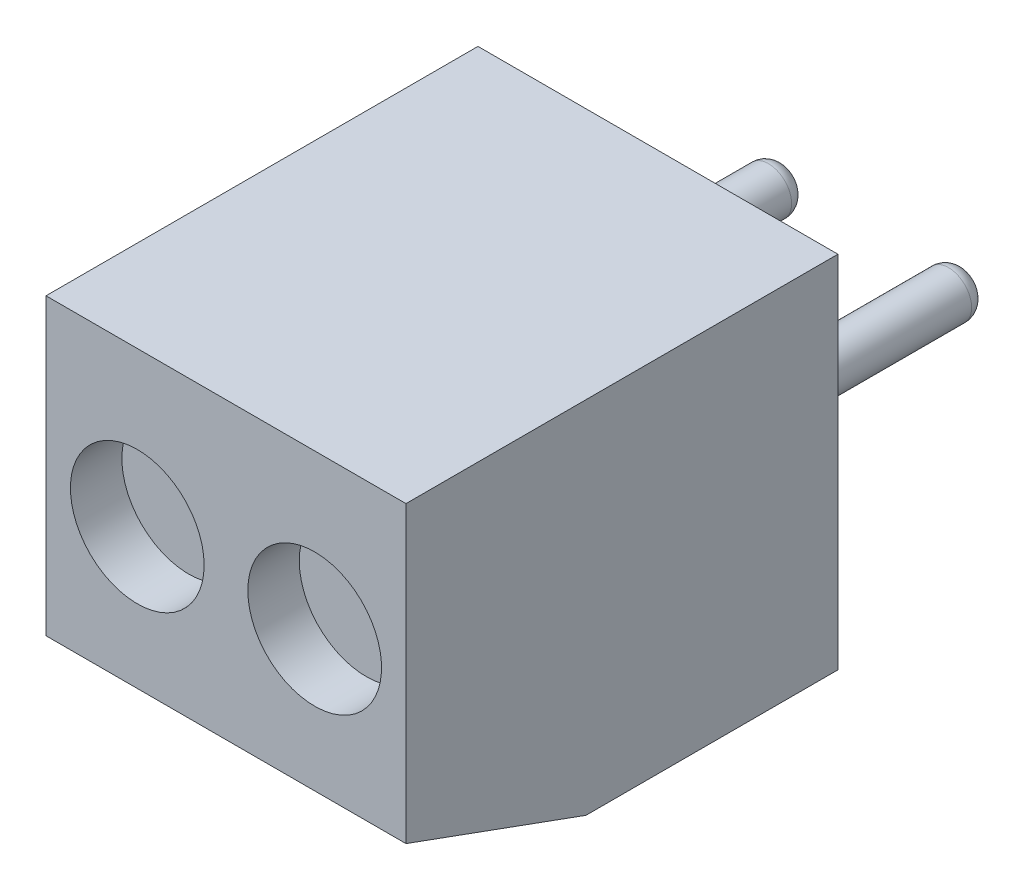
ISO-10303-21;
HEADER;
FILE_DESCRIPTION(('STEP AP214'),'2;1');
FILE_NAME('part.step','',(''),(''),'','','');
FILE_SCHEMA(('AUTOMOTIVE_DESIGN { 1 0 10303 214 1 1 1 1 }'));
ENDSEC;
DATA;
#1=APPLICATION_CONTEXT('core data for automotive mechanical design processes');
#2=APPLICATION_PROTOCOL_DEFINITION('international standard','automotive_design',2000,#1);
#3=PRODUCT_CONTEXT('',#1,'mechanical');
#4=PRODUCT('Part','Part','',(#3));
#5=PRODUCT_RELATED_PRODUCT_CATEGORY('part','',(#4));
#6=PRODUCT_DEFINITION_FORMATION('','',#4);
#7=PRODUCT_DEFINITION_CONTEXT('part definition',#1,'design');
#8=PRODUCT_DEFINITION('design','',#6,#7);
#9=PRODUCT_DEFINITION_SHAPE('','',#8);
#10=(LENGTH_UNIT() NAMED_UNIT(*) SI_UNIT(.MILLI.,.METRE.));
#11=(NAMED_UNIT(*) PLANE_ANGLE_UNIT() SI_UNIT($,.RADIAN.));
#12=(NAMED_UNIT(*) SI_UNIT($,.STERADIAN.) SOLID_ANGLE_UNIT());
#13=UNCERTAINTY_MEASURE_WITH_UNIT(LENGTH_MEASURE(1.E-05),#10,'distance_accuracy_value','');
#14=(GEOMETRIC_REPRESENTATION_CONTEXT(3) GLOBAL_UNCERTAINTY_ASSIGNED_CONTEXT((#13)) GLOBAL_UNIT_ASSIGNED_CONTEXT((#10,
#11,#12)) REPRESENTATION_CONTEXT('',''));
#15=CARTESIAN_POINT('',(0.,0.,0.));
#16=DIRECTION('',(0.,0.,1.));
#17=DIRECTION('',(1.,0.,0.));
#18=AXIS2_PLACEMENT_3D('',#15,#16,#17);
#19=CARTESIAN_POINT('',(0.,0.,0.));
#20=DIRECTION('',(0.,0.,-1.));
#21=DIRECTION('',(-1.,0.,0.));
#22=AXIS2_PLACEMENT_3D('',#19,#20,#21);
#23=PLANE('',#22);
#24=CARTESIAN_POINT('',(1.75,0.,0.));
#25=DIRECTION('',(0.,0.,-1.));
#26=DIRECTION('',(-1.,0.,0.));
#27=AXIS2_PLACEMENT_3D('',#24,#25,#26);
#28=CIRCLE('',#27,0.45);
#29=CARTESIAN_POINT('',(1.3,0.,0.));
#30=VERTEX_POINT('',#29);
#31=EDGE_CURVE('E318',#30,#30,#28,.T.);
#32=ORIENTED_EDGE('',*,*,#31,.F.);
#33=EDGE_LOOP('',(#32));
#34=FACE_BOUND('',#33,.T.);
#35=DIRECTION('',(0.,1.,0.));
#36=VECTOR('',#35,1.);
#37=CARTESIAN_POINT('',(3.5,-3.5,0.));
#38=LINE('',#37,#36);
#39=CARTESIAN_POINT('',(3.5,-3.5,0.));
#40=VERTEX_POINT('',#39);
#41=CARTESIAN_POINT('',(3.5,3.5,0.));
#42=VERTEX_POINT('',#41);
#43=EDGE_CURVE('E201',#40,#42,#38,.T.);
#44=ORIENTED_EDGE('',*,*,#43,.F.);
#45=DIRECTION('',(1.,0.,0.));
#46=VECTOR('',#45,1.);
#47=CARTESIAN_POINT('',(-3.5,-3.5,0.));
#48=LINE('',#47,#46);
#49=CARTESIAN_POINT('',(-3.5,-3.5,0.));
#50=VERTEX_POINT('',#49);
#51=EDGE_CURVE('E210',#50,#40,#48,.T.);
#52=ORIENTED_EDGE('',*,*,#51,.F.);
#53=DIRECTION('',(0.,-1.,0.));
#54=VECTOR('',#53,1.);
#55=CARTESIAN_POINT('',(-3.5,-3.5,0.));
#56=LINE('',#55,#54);
#57=CARTESIAN_POINT('',(-3.5,3.5,0.));
#58=VERTEX_POINT('',#57);
#59=EDGE_CURVE('E220',#58,#50,#56,.T.);
#60=ORIENTED_EDGE('',*,*,#59,.F.);
#61=DIRECTION('',(-1.,0.,0.));
#62=VECTOR('',#61,1.);
#63=CARTESIAN_POINT('',(-3.5,3.5,0.));
#64=LINE('',#63,#62);
#65=EDGE_CURVE('E218',#42,#58,#64,.T.);
#66=ORIENTED_EDGE('',*,*,#65,.F.);
#67=EDGE_LOOP('',(#44,#52,#60,#66));
#68=FACE_BOUND('',#67,.T.);
#69=CARTESIAN_POINT('',(-1.75,0.,0.));
#70=DIRECTION('',(0.,0.,-1.));
#71=DIRECTION('',(1.,0.,0.));
#72=AXIS2_PLACEMENT_3D('',#69,#70,#71);
#73=CIRCLE('',#72,0.45);
#74=CARTESIAN_POINT('',(-1.3,0.,0.));
#75=VERTEX_POINT('',#74);
#76=EDGE_CURVE('E316',#75,#75,#73,.T.);
#77=ORIENTED_EDGE('',*,*,#76,.F.);
#78=EDGE_LOOP('',(#77));
#79=FACE_BOUND('',#78,.T.);
#80=ADVANCED_FACE('F40',(#34,#68,#79),#23,.T.);
#81=CARTESIAN_POINT('',(3.5,-3.5,8.4));
#82=DIRECTION('',(-1.,0.,0.));
#83=DIRECTION('',(0.,0.,1.));
#84=AXIS2_PLACEMENT_3D('',#81,#82,#83);
#85=PLANE('',#84);
#86=DIRECTION('',(0.,1.,0.));
#87=VECTOR('',#86,1.);
#88=CARTESIAN_POINT('',(3.5,-3.5,8.4));
#89=LINE('',#88,#87);
#90=CARTESIAN_POINT('',(3.5,-2.22610418006829,8.4));
#91=VERTEX_POINT('',#90);
#92=CARTESIAN_POINT('',(3.5,3.5,8.4));
#93=VERTEX_POINT('',#92);
#94=EDGE_CURVE('E207',#91,#93,#89,.T.);
#95=ORIENTED_EDGE('',*,*,#94,.F.);
#96=DIRECTION('',(0.,0.342020143325666,0.939692620785909));
#97=VECTOR('',#96,1.);
#98=CARTESIAN_POINT('',(3.5,-2.22610418006829,8.4));
#99=LINE('',#98,#97);
#100=CARTESIAN_POINT('',(3.5,-3.5,4.89999999999997));
#101=VERTEX_POINT('',#100);
#102=EDGE_CURVE('E237',#91,#101,#99,.F.);
#103=ORIENTED_EDGE('',*,*,#102,.T.);
#104=DIRECTION('',(0.,0.,-1.));
#105=VECTOR('',#104,1.);
#106=CARTESIAN_POINT('',(3.5,-3.5,8.4));
#107=LINE('',#106,#105);
#108=EDGE_CURVE('E215',#101,#40,#107,.T.);
#109=ORIENTED_EDGE('',*,*,#108,.T.);
#110=ORIENTED_EDGE('',*,*,#43,.T.);
#111=DIRECTION('',(0.,0.,-1.));
#112=VECTOR('',#111,1.);
#113=CARTESIAN_POINT('',(3.5,3.5,8.4));
#114=LINE('',#113,#112);
#115=EDGE_CURVE('E231',#93,#42,#114,.T.);
#116=ORIENTED_EDGE('',*,*,#115,.F.);
#117=EDGE_LOOP('',(#95,#103,#109,#110,#116));
#118=FACE_BOUND('',#117,.T.);
#119=ADVANCED_FACE('F262',(#118),#85,.F.);
#120=CARTESIAN_POINT('',(-3.5,3.5,8.4));
#121=DIRECTION('',(0.,-1.,0.));
#122=DIRECTION('',(0.,0.,-1.));
#123=AXIS2_PLACEMENT_3D('',#120,#121,#122);
#124=PLANE('',#123);
#125=ORIENTED_EDGE('',*,*,#65,.T.);
#126=DIRECTION('',(0.,0.,-1.));
#127=VECTOR('',#126,1.);
#128=CARTESIAN_POINT('',(-3.5,3.5,8.4));
#129=LINE('',#128,#127);
#130=CARTESIAN_POINT('',(-3.5,3.5,8.4));
#131=VERTEX_POINT('',#130);
#132=EDGE_CURVE('E228',#131,#58,#129,.T.);
#133=ORIENTED_EDGE('',*,*,#132,.F.);
#134=DIRECTION('',(-1.,0.,0.));
#135=VECTOR('',#134,1.);
#136=CARTESIAN_POINT('',(-3.5,3.5,8.4));
#137=LINE('',#136,#135);
#138=EDGE_CURVE('E209',#93,#131,#137,.T.);
#139=ORIENTED_EDGE('',*,*,#138,.F.);
#140=ORIENTED_EDGE('',*,*,#115,.T.);
#141=EDGE_LOOP('',(#125,#133,#139,#140));
#142=FACE_BOUND('',#141,.T.);
#143=ADVANCED_FACE('F268',(#142),#124,.F.);
#144=CARTESIAN_POINT('',(-3.5,-3.5,8.4));
#145=DIRECTION('',(1.,0.,0.));
#146=DIRECTION('',(0.,0.,-1.));
#147=AXIS2_PLACEMENT_3D('',#144,#145,#146);
#148=PLANE('',#147);
#149=DIRECTION('',(0.,0.,-1.));
#150=VECTOR('',#149,1.);
#151=CARTESIAN_POINT('',(-3.5,-3.5,8.4));
#152=LINE('',#151,#150);
#153=CARTESIAN_POINT('',(-3.5,-3.5,4.89999999999997));
#154=VERTEX_POINT('',#153);
#155=EDGE_CURVE('E226',#154,#50,#152,.T.);
#156=ORIENTED_EDGE('',*,*,#155,.F.);
#157=DIRECTION('',(0.,-0.342020143325666,-0.939692620785909));
#158=VECTOR('',#157,1.);
#159=CARTESIAN_POINT('',(-3.5,-2.22610418006829,8.4));
#160=LINE('',#159,#158);
#161=CARTESIAN_POINT('',(-3.5,-2.22610418006829,8.4));
#162=VERTEX_POINT('',#161);
#163=EDGE_CURVE('E241',#154,#162,#160,.F.);
#164=ORIENTED_EDGE('',*,*,#163,.T.);
#165=DIRECTION('',(0.,-1.,0.));
#166=VECTOR('',#165,1.);
#167=CARTESIAN_POINT('',(-3.5,-3.5,8.4));
#168=LINE('',#167,#166);
#169=EDGE_CURVE('E212',#131,#162,#168,.T.);
#170=ORIENTED_EDGE('',*,*,#169,.F.);
#171=ORIENTED_EDGE('',*,*,#132,.T.);
#172=ORIENTED_EDGE('',*,*,#59,.T.);
#173=EDGE_LOOP('',(#156,#164,#170,#171,#172));
#174=FACE_BOUND('',#173,.T.);
#175=ADVANCED_FACE('F280',(#174),#148,.F.);
#176=CARTESIAN_POINT('',(-3.5,-3.5,8.4));
#177=DIRECTION('',(0.,1.,0.));
#178=DIRECTION('',(0.,0.,1.));
#179=AXIS2_PLACEMENT_3D('',#176,#177,#178);
#180=PLANE('',#179);
#181=DIRECTION('',(0.,0.,-1.));
#182=VECTOR('',#181,1.);
#183=CARTESIAN_POINT('',(0.3,-3.5,4.7));
#184=LINE('',#183,#182);
#185=CARTESIAN_POINT('',(0.3,-3.5,4.7));
#186=VERTEX_POINT('',#185);
#187=CARTESIAN_POINT('',(0.299999999999999,-3.5,0.5));
#188=VERTEX_POINT('',#187);
#189=EDGE_CURVE('E167',#186,#188,#184,.T.);
#190=ORIENTED_EDGE('',*,*,#189,.F.);
#191=DIRECTION('',(-1.,0.,0.));
#192=VECTOR('',#191,1.);
#193=CARTESIAN_POINT('',(3.15,-3.5,4.7));
#194=LINE('',#193,#192);
#195=CARTESIAN_POINT('',(3.15,-3.5,4.7));
#196=VERTEX_POINT('',#195);
#197=EDGE_CURVE('E55',#196,#186,#194,.T.);
#198=ORIENTED_EDGE('',*,*,#197,.F.);
#199=DIRECTION('',(0.,0.,1.));
#200=VECTOR('',#199,1.);
#201=CARTESIAN_POINT('',(3.15,-3.5,4.7));
#202=LINE('',#201,#200);
#203=CARTESIAN_POINT('',(3.15,-3.5,0.5));
#204=VERTEX_POINT('',#203);
#205=EDGE_CURVE('E155',#204,#196,#202,.T.);
#206=ORIENTED_EDGE('',*,*,#205,.F.);
#207=DIRECTION('',(1.,0.,0.));
#208=VECTOR('',#207,1.);
#209=CARTESIAN_POINT('',(3.15,-3.5,0.5));
#210=LINE('',#209,#208);
#211=EDGE_CURVE('E158',#188,#204,#210,.T.);
#212=ORIENTED_EDGE('',*,*,#211,.F.);
#213=EDGE_LOOP('',(#190,#198,#206,#212));
#214=FACE_BOUND('',#213,.T.);
#215=DIRECTION('',(1.,0.,0.));
#216=VECTOR('',#215,1.);
#217=CARTESIAN_POINT('',(-3.15,-3.5,0.5));
#218=LINE('',#217,#216);
#219=CARTESIAN_POINT('',(-3.15,-3.5,0.5));
#220=VERTEX_POINT('',#219);
#221=CARTESIAN_POINT('',(-0.299999999999999,-3.5,0.5));
#222=VERTEX_POINT('',#221);
#223=EDGE_CURVE('E191',#220,#222,#218,.T.);
#224=ORIENTED_EDGE('',*,*,#223,.F.);
#225=DIRECTION('',(0.,0.,-1.));
#226=VECTOR('',#225,1.);
#227=CARTESIAN_POINT('',(-3.15,-3.5,4.7));
#228=LINE('',#227,#226);
#229=CARTESIAN_POINT('',(-3.15,-3.5,4.7));
#230=VERTEX_POINT('',#229);
#231=EDGE_CURVE('E63',#230,#220,#228,.T.);
#232=ORIENTED_EDGE('',*,*,#231,.F.);
#233=DIRECTION('',(-1.,0.,0.));
#234=VECTOR('',#233,1.);
#235=CARTESIAN_POINT('',(-3.15,-3.5,4.7));
#236=LINE('',#235,#234);
#237=CARTESIAN_POINT('',(-0.3,-3.5,4.7));
#238=VERTEX_POINT('',#237);
#239=EDGE_CURVE('E180',#238,#230,#236,.T.);
#240=ORIENTED_EDGE('',*,*,#239,.F.);
#241=DIRECTION('',(0.,0.,1.));
#242=VECTOR('',#241,1.);
#243=CARTESIAN_POINT('',(-0.3,-3.5,4.7));
#244=LINE('',#243,#242);
#245=EDGE_CURVE('E194',#222,#238,#244,.T.);
#246=ORIENTED_EDGE('',*,*,#245,.F.);
#247=EDGE_LOOP('',(#224,#232,#240,#246));
#248=FACE_BOUND('',#247,.T.);
#249=ORIENTED_EDGE('',*,*,#108,.F.);
#250=DIRECTION('',(-1.,0.,0.));
#251=VECTOR('',#250,1.);
#252=CARTESIAN_POINT('',(-3.5,-3.5,4.89999999999997));
#253=LINE('',#252,#251);
#254=EDGE_CURVE('E239',#101,#154,#253,.T.);
#255=ORIENTED_EDGE('',*,*,#254,.T.);
#256=ORIENTED_EDGE('',*,*,#155,.T.);
#257=ORIENTED_EDGE('',*,*,#51,.T.);
#258=EDGE_LOOP('',(#249,#255,#256,#257));
#259=FACE_BOUND('',#258,.T.);
#260=ADVANCED_FACE('F277',(#214,#248,#259),#180,.F.);
#261=CARTESIAN_POINT('',(0.,0.,8.4));
#262=DIRECTION('',(0.,0.,-1.));
#263=DIRECTION('',(-1.,0.,0.));
#264=AXIS2_PLACEMENT_3D('',#261,#262,#263);
#265=PLANE('',#264);
#266=CARTESIAN_POINT('',(1.725,0.499999999999998,8.4));
#267=DIRECTION('',(0.,0.,1.));
#268=DIRECTION('',(-1.,0.,0.));
#269=AXIS2_PLACEMENT_3D('',#266,#267,#268);
#270=CIRCLE('',#269,1.3);
#271=CARTESIAN_POINT('',(0.425,0.499999999999998,8.4));
#272=VERTEX_POINT('',#271);
#273=EDGE_CURVE('E321',#272,#272,#270,.T.);
#274=ORIENTED_EDGE('',*,*,#273,.F.);
#275=EDGE_LOOP('',(#274));
#276=FACE_BOUND('',#275,.T.);
#277=CARTESIAN_POINT('',(-1.725,0.499999999999998,8.4));
#278=DIRECTION('',(0.,0.,1.));
#279=DIRECTION('',(1.,0.,0.));
#280=AXIS2_PLACEMENT_3D('',#277,#278,#279);
#281=CIRCLE('',#280,1.3);
#282=CARTESIAN_POINT('',(-0.425,0.499999999999998,8.4));
#283=VERTEX_POINT('',#282);
#284=EDGE_CURVE('E327',#283,#283,#281,.T.);
#285=ORIENTED_EDGE('',*,*,#284,.F.);
#286=EDGE_LOOP('',(#285));
#287=FACE_BOUND('',#286,.T.);
#288=ORIENTED_EDGE('',*,*,#169,.T.);
#289=DIRECTION('',(1.,0.,0.));
#290=VECTOR('',#289,1.);
#291=CARTESIAN_POINT('',(0.,-2.22610418006829,8.4));
#292=LINE('',#291,#290);
#293=EDGE_CURVE('E234',#162,#91,#292,.T.);
#294=ORIENTED_EDGE('',*,*,#293,.T.);
#295=ORIENTED_EDGE('',*,*,#94,.T.);
#296=ORIENTED_EDGE('',*,*,#138,.T.);
#297=EDGE_LOOP('',(#288,#294,#295,#296));
#298=FACE_BOUND('',#297,.T.);
#299=ADVANCED_FACE('F275',(#276,#287,#298),#265,.F.);
#300=CARTESIAN_POINT('',(0.,-2.22610418006829,8.4));
#301=DIRECTION('',(0.,0.939692620785909,-0.342020143325666));
#302=DIRECTION('',(1.,0.,0.));
#303=AXIS2_PLACEMENT_3D('',#300,#301,#302);
#304=PLANE('',#303);
#305=ORIENTED_EDGE('',*,*,#163,.F.);
#306=ORIENTED_EDGE('',*,*,#254,.F.);
#307=ORIENTED_EDGE('',*,*,#102,.F.);
#308=ORIENTED_EDGE('',*,*,#293,.F.);
#309=EDGE_LOOP('',(#305,#306,#307,#308));
#310=FACE_BOUND('',#309,.T.);
#311=ADVANCED_FACE('F288',(#310),#304,.F.);
#312=CARTESIAN_POINT('',(-3.15,-1.7,4.7));
#313=DIRECTION('',(-1.,0.,0.));
#314=DIRECTION('',(0.,0.,1.));
#315=AXIS2_PLACEMENT_3D('',#312,#313,#314);
#316=PLANE('',#315);
#317=ORIENTED_EDGE('',*,*,#231,.T.);
#318=DIRECTION('',(0.,-1.,0.));
#319=VECTOR('',#318,1.);
#320=CARTESIAN_POINT('',(-3.15,-1.7,0.5));
#321=LINE('',#320,#319);
#322=CARTESIAN_POINT('',(-3.15,-1.7,0.5));
#323=VERTEX_POINT('',#322);
#324=EDGE_CURVE('E189',#323,#220,#321,.T.);
#325=ORIENTED_EDGE('',*,*,#324,.F.);
#326=DIRECTION('',(0.,0.,-1.));
#327=VECTOR('',#326,1.);
#328=CARTESIAN_POINT('',(-3.15,-1.7,4.7));
#329=LINE('',#328,#327);
#330=CARTESIAN_POINT('',(-3.15,-1.7,4.7));
#331=VERTEX_POINT('',#330);
#332=EDGE_CURVE('E176',#331,#323,#329,.T.);
#333=ORIENTED_EDGE('',*,*,#332,.F.);
#334=DIRECTION('',(0.,-1.,0.));
#335=VECTOR('',#334,1.);
#336=CARTESIAN_POINT('',(-3.15,-1.7,4.7));
#337=LINE('',#336,#335);
#338=EDGE_CURVE('E199',#331,#230,#337,.T.);
#339=ORIENTED_EDGE('',*,*,#338,.T.);
#340=EDGE_LOOP('',(#317,#325,#333,#339));
#341=FACE_BOUND('',#340,.T.);
#342=ADVANCED_FACE('F290',(#341),#316,.F.);
#343=CARTESIAN_POINT('',(-3.15,-1.7,4.7));
#344=DIRECTION('',(0.,0.,1.));
#345=DIRECTION('',(1.,0.,0.));
#346=AXIS2_PLACEMENT_3D('',#343,#344,#345);
#347=PLANE('',#346);
#348=ORIENTED_EDGE('',*,*,#239,.T.);
#349=ORIENTED_EDGE('',*,*,#338,.F.);
#350=DIRECTION('',(-1.,0.,0.));
#351=VECTOR('',#350,1.);
#352=CARTESIAN_POINT('',(-3.15,-1.7,4.7));
#353=LINE('',#352,#351);
#354=CARTESIAN_POINT('',(-0.3,-1.7,4.7));
#355=VERTEX_POINT('',#354);
#356=EDGE_CURVE('E186',#355,#331,#353,.T.);
#357=ORIENTED_EDGE('',*,*,#356,.F.);
#358=DIRECTION('',(0.,-1.,0.));
#359=VECTOR('',#358,1.);
#360=CARTESIAN_POINT('',(-0.3,-1.7,4.7));
#361=LINE('',#360,#359);
#362=EDGE_CURVE('E202',#355,#238,#361,.T.);
#363=ORIENTED_EDGE('',*,*,#362,.T.);
#364=EDGE_LOOP('',(#348,#349,#357,#363));
#365=FACE_BOUND('',#364,.T.);
#366=ADVANCED_FACE('F296',(#365),#347,.F.);
#367=CARTESIAN_POINT('',(-0.3,-1.7,4.7));
#368=DIRECTION('',(1.,0.,0.));
#369=DIRECTION('',(0.,0.,-1.));
#370=AXIS2_PLACEMENT_3D('',#367,#368,#369);
#371=PLANE('',#370);
#372=ORIENTED_EDGE('',*,*,#245,.T.);
#373=ORIENTED_EDGE('',*,*,#362,.F.);
#374=DIRECTION('',(0.,0.,1.));
#375=VECTOR('',#374,1.);
#376=CARTESIAN_POINT('',(-0.3,-1.7,4.7));
#377=LINE('',#376,#375);
#378=CARTESIAN_POINT('',(-0.299999999999999,-1.7,0.5));
#379=VERTEX_POINT('',#378);
#380=EDGE_CURVE('E183',#379,#355,#377,.T.);
#381=ORIENTED_EDGE('',*,*,#380,.F.);
#382=DIRECTION('',(0.,-1.,0.));
#383=VECTOR('',#382,1.);
#384=CARTESIAN_POINT('',(-0.299999999999999,-1.7,0.5));
#385=LINE('',#384,#383);
#386=EDGE_CURVE('E204',#379,#222,#385,.T.);
#387=ORIENTED_EDGE('',*,*,#386,.T.);
#388=EDGE_LOOP('',(#372,#373,#381,#387));
#389=FACE_BOUND('',#388,.T.);
#390=ADVANCED_FACE('F385',(#389),#371,.F.);
#391=CARTESIAN_POINT('',(-3.15,-1.7,0.5));
#392=DIRECTION('',(0.,0.,-1.));
#393=DIRECTION('',(-1.,0.,0.));
#394=AXIS2_PLACEMENT_3D('',#391,#392,#393);
#395=PLANE('',#394);
#396=ORIENTED_EDGE('',*,*,#223,.T.);
#397=ORIENTED_EDGE('',*,*,#386,.F.);
#398=DIRECTION('',(1.,0.,0.));
#399=VECTOR('',#398,1.);
#400=CARTESIAN_POINT('',(-3.15,-1.7,0.5));
#401=LINE('',#400,#399);
#402=EDGE_CURVE('E179',#323,#379,#401,.T.);
#403=ORIENTED_EDGE('',*,*,#402,.F.);
#404=ORIENTED_EDGE('',*,*,#324,.T.);
#405=EDGE_LOOP('',(#396,#397,#403,#404));
#406=FACE_BOUND('',#405,.T.);
#407=ADVANCED_FACE('F381',(#406),#395,.F.);
#408=CARTESIAN_POINT('',(0.,-1.7,0.));
#409=DIRECTION('',(0.,-1.,0.));
#410=DIRECTION('',(0.,0.,-1.));
#411=AXIS2_PLACEMENT_3D('',#408,#409,#410);
#412=PLANE('',#411);
#413=CARTESIAN_POINT('',(-1.725,-1.7,2.6));
#414=DIRECTION('',(0.,-1.,0.));
#415=DIRECTION('',(0.,0.,-1.));
#416=AXIS2_PLACEMENT_3D('',#413,#414,#415);
#417=CIRCLE('',#416,1.);
#418=CARTESIAN_POINT('',(-1.725,-1.7,1.6));
#419=VERTEX_POINT('',#418);
#420=EDGE_CURVE('E340',#419,#419,#417,.T.);
#421=ORIENTED_EDGE('',*,*,#420,.F.);
#422=EDGE_LOOP('',(#421));
#423=FACE_BOUND('',#422,.T.);
#424=ORIENTED_EDGE('',*,*,#332,.T.);
#425=ORIENTED_EDGE('',*,*,#402,.T.);
#426=ORIENTED_EDGE('',*,*,#380,.T.);
#427=ORIENTED_EDGE('',*,*,#356,.T.);
#428=EDGE_LOOP('',(#424,#425,#426,#427));
#429=FACE_BOUND('',#428,.T.);
#430=ADVANCED_FACE('F378',(#423,#429),#412,.T.);
#431=CARTESIAN_POINT('',(3.15,-1.7,4.7));
#432=DIRECTION('',(0.,0.,1.));
#433=DIRECTION('',(1.,0.,0.));
#434=AXIS2_PLACEMENT_3D('',#431,#432,#433);
#435=PLANE('',#434);
#436=ORIENTED_EDGE('',*,*,#197,.T.);
#437=DIRECTION('',(0.,-1.,0.));
#438=VECTOR('',#437,1.);
#439=CARTESIAN_POINT('',(0.3,-1.7,4.7));
#440=LINE('',#439,#438);
#441=CARTESIAN_POINT('',(0.3,-1.7,4.7));
#442=VERTEX_POINT('',#441);
#443=EDGE_CURVE('E133',#442,#186,#440,.T.);
#444=ORIENTED_EDGE('',*,*,#443,.F.);
#445=DIRECTION('',(-1.,0.,0.));
#446=VECTOR('',#445,1.);
#447=CARTESIAN_POINT('',(3.15,-1.7,4.7));
#448=LINE('',#447,#446);
#449=CARTESIAN_POINT('',(3.15,-1.7,4.7));
#450=VERTEX_POINT('',#449);
#451=EDGE_CURVE('E137',#450,#442,#448,.T.);
#452=ORIENTED_EDGE('',*,*,#451,.F.);
#453=DIRECTION('',(0.,-1.,0.));
#454=VECTOR('',#453,1.);
#455=CARTESIAN_POINT('',(3.15,-1.7,4.7));
#456=LINE('',#455,#454);
#457=EDGE_CURVE('E171',#450,#196,#456,.T.);
#458=ORIENTED_EDGE('',*,*,#457,.T.);
#459=EDGE_LOOP('',(#436,#444,#452,#458));
#460=FACE_BOUND('',#459,.T.);
#461=ADVANCED_FACE('F135',(#460),#435,.F.);
#462=CARTESIAN_POINT('',(3.15,-1.7,4.7));
#463=DIRECTION('',(1.,0.,0.));
#464=DIRECTION('',(0.,0.,-1.));
#465=AXIS2_PLACEMENT_3D('',#462,#463,#464);
#466=PLANE('',#465);
#467=ORIENTED_EDGE('',*,*,#205,.T.);
#468=ORIENTED_EDGE('',*,*,#457,.F.);
#469=DIRECTION('',(0.,0.,1.));
#470=VECTOR('',#469,1.);
#471=CARTESIAN_POINT('',(3.15,-1.7,4.7));
#472=LINE('',#471,#470);
#473=CARTESIAN_POINT('',(3.15,-1.7,0.5));
#474=VERTEX_POINT('',#473);
#475=EDGE_CURVE('E143',#474,#450,#472,.T.);
#476=ORIENTED_EDGE('',*,*,#475,.F.);
#477=DIRECTION('',(0.,-1.,0.));
#478=VECTOR('',#477,1.);
#479=CARTESIAN_POINT('',(3.15,-1.7,0.5));
#480=LINE('',#479,#478);
#481=EDGE_CURVE('E173',#474,#204,#480,.T.);
#482=ORIENTED_EDGE('',*,*,#481,.T.);
#483=EDGE_LOOP('',(#467,#468,#476,#482));
#484=FACE_BOUND('',#483,.T.);
#485=ADVANCED_FACE('F366',(#484),#466,.F.);
#486=CARTESIAN_POINT('',(3.15,-1.7,0.5));
#487=DIRECTION('',(0.,0.,-1.));
#488=DIRECTION('',(-1.,0.,0.));
#489=AXIS2_PLACEMENT_3D('',#486,#487,#488);
#490=PLANE('',#489);
#491=ORIENTED_EDGE('',*,*,#211,.T.);
#492=ORIENTED_EDGE('',*,*,#481,.F.);
#493=DIRECTION('',(1.,0.,0.));
#494=VECTOR('',#493,1.);
#495=CARTESIAN_POINT('',(3.15,-1.7,0.5));
#496=LINE('',#495,#494);
#497=CARTESIAN_POINT('',(0.299999999999999,-1.7,0.5));
#498=VERTEX_POINT('',#497);
#499=EDGE_CURVE('E151',#498,#474,#496,.T.);
#500=ORIENTED_EDGE('',*,*,#499,.F.);
#501=DIRECTION('',(0.,-1.,0.));
#502=VECTOR('',#501,1.);
#503=CARTESIAN_POINT('',(0.299999999999999,-1.7,0.5));
#504=LINE('',#503,#502);
#505=EDGE_CURVE('E142',#498,#188,#504,.T.);
#506=ORIENTED_EDGE('',*,*,#505,.T.);
#507=EDGE_LOOP('',(#491,#492,#500,#506));
#508=FACE_BOUND('',#507,.T.);
#509=ADVANCED_FACE('F369',(#508),#490,.F.);
#510=CARTESIAN_POINT('',(0.3,-1.7,4.7));
#511=DIRECTION('',(-1.,0.,0.));
#512=DIRECTION('',(0.,0.,1.));
#513=AXIS2_PLACEMENT_3D('',#510,#511,#512);
#514=PLANE('',#513);
#515=ORIENTED_EDGE('',*,*,#189,.T.);
#516=ORIENTED_EDGE('',*,*,#505,.F.);
#517=DIRECTION('',(0.,0.,-1.));
#518=VECTOR('',#517,1.);
#519=CARTESIAN_POINT('',(0.3,-1.7,4.7));
#520=LINE('',#519,#518);
#521=EDGE_CURVE('E146',#442,#498,#520,.T.);
#522=ORIENTED_EDGE('',*,*,#521,.F.);
#523=ORIENTED_EDGE('',*,*,#443,.T.);
#524=EDGE_LOOP('',(#515,#516,#522,#523));
#525=FACE_BOUND('',#524,.T.);
#526=ADVANCED_FACE('F147',(#525),#514,.F.);
#527=CARTESIAN_POINT('',(0.,-1.7,0.));
#528=DIRECTION('',(0.,-1.,0.));
#529=DIRECTION('',(0.,0.,-1.));
#530=AXIS2_PLACEMENT_3D('',#527,#528,#529);
#531=PLANE('',#530);
#532=CARTESIAN_POINT('',(1.725,-1.7,2.6));
#533=DIRECTION('',(0.,-1.,0.));
#534=DIRECTION('',(0.,0.,1.));
#535=AXIS2_PLACEMENT_3D('',#532,#533,#534);
#536=CIRCLE('',#535,1.);
#537=CARTESIAN_POINT('',(1.725,-1.7,3.6));
#538=VERTEX_POINT('',#537);
#539=EDGE_CURVE('E333',#538,#538,#536,.T.);
#540=ORIENTED_EDGE('',*,*,#539,.F.);
#541=EDGE_LOOP('',(#540));
#542=FACE_BOUND('',#541,.T.);
#543=ORIENTED_EDGE('',*,*,#451,.T.);
#544=ORIENTED_EDGE('',*,*,#521,.T.);
#545=ORIENTED_EDGE('',*,*,#499,.T.);
#546=ORIENTED_EDGE('',*,*,#475,.T.);
#547=EDGE_LOOP('',(#543,#544,#545,#546));
#548=FACE_BOUND('',#547,.T.);
#549=ADVANCED_FACE('F153',(#542,#548),#531,.T.);
#550=CARTESIAN_POINT('',(-1.725,6.32842712474619,2.6));
#551=DIRECTION('',(0.,-1.,0.));
#552=DIRECTION('',(0.,0.,-1.));
#553=AXIS2_PLACEMENT_3D('',#550,#551,#552);
#554=CYLINDRICAL_SURFACE('',#553,1.);
#555=CARTESIAN_POINT('',(-1.725,2.5,2.6));
#556=DIRECTION('',(0.,-1.,0.));
#557=DIRECTION('',(0.,0.,-1.));
#558=AXIS2_PLACEMENT_3D('',#555,#556,#557);
#559=CIRCLE('',#558,1.);
#560=CARTESIAN_POINT('',(-1.725,2.5,1.6));
#561=VERTEX_POINT('',#560);
#562=EDGE_CURVE('E161',#561,#561,#559,.F.);
#563=ORIENTED_EDGE('',*,*,#562,.T.);
#564=EDGE_LOOP('',(#563));
#565=FACE_BOUND('',#564,.T.);
#566=ORIENTED_EDGE('',*,*,#420,.T.);
#567=EDGE_LOOP('',(#566));
#568=FACE_BOUND('',#567,.T.);
#569=ADVANCED_FACE('F347',(#565,#568),#554,.F.);
#570=CARTESIAN_POINT('',(-3.5,2.5,8.4));
#571=DIRECTION('',(0.,-1.,0.));
#572=DIRECTION('',(0.,0.,-1.));
#573=AXIS2_PLACEMENT_3D('',#570,#571,#572);
#574=PLANE('',#573);
#575=ORIENTED_EDGE('',*,*,#562,.F.);
#576=EDGE_LOOP('',(#575));
#577=FACE_BOUND('',#576,.T.);
#578=ADVANCED_FACE('F349',(#577),#574,.T.);
#579=CARTESIAN_POINT('',(1.725,6.32842712474619,2.6));
#580=DIRECTION('',(0.,-1.,0.));
#581=DIRECTION('',(0.,0.,-1.));
#582=AXIS2_PLACEMENT_3D('',#579,#580,#581);
#583=CYLINDRICAL_SURFACE('',#582,1.);
#584=CARTESIAN_POINT('',(1.725,2.5,2.6));
#585=DIRECTION('',(0.,-1.,0.));
#586=DIRECTION('',(0.,0.,-1.));
#587=AXIS2_PLACEMENT_3D('',#584,#585,#586);
#588=CIRCLE('',#587,1.);
#589=CARTESIAN_POINT('',(1.725,2.5,1.6));
#590=VERTEX_POINT('',#589);
#591=EDGE_CURVE('E338',#590,#590,#588,.F.);
#592=ORIENTED_EDGE('',*,*,#591,.T.);
#593=EDGE_LOOP('',(#592));
#594=FACE_BOUND('',#593,.T.);
#595=ORIENTED_EDGE('',*,*,#539,.T.);
#596=EDGE_LOOP('',(#595));
#597=FACE_BOUND('',#596,.T.);
#598=ADVANCED_FACE('F351',(#594,#597),#583,.F.);
#599=CARTESIAN_POINT('',(-3.5,2.5,8.4));
#600=DIRECTION('',(0.,-1.,0.));
#601=DIRECTION('',(0.,0.,-1.));
#602=AXIS2_PLACEMENT_3D('',#599,#600,#601);
#603=PLANE('',#602);
#604=ORIENTED_EDGE('',*,*,#591,.F.);
#605=EDGE_LOOP('',(#604));
#606=FACE_BOUND('',#605,.T.);
#607=ADVANCED_FACE('F357',(#606),#603,.T.);
#608=CARTESIAN_POINT('',(-1.725,0.499999999999998,7.4));
#609=DIRECTION('',(0.,0.,1.));
#610=DIRECTION('',(1.,0.,0.));
#611=AXIS2_PLACEMENT_3D('',#608,#609,#610);
#612=CYLINDRICAL_SURFACE('',#611,1.3);
#613=CARTESIAN_POINT('',(-1.725,0.499999999999998,7.4));
#614=DIRECTION('',(0.,0.,1.));
#615=DIRECTION('',(1.,0.,0.));
#616=AXIS2_PLACEMENT_3D('',#613,#614,#615);
#617=CIRCLE('',#616,1.3);
#618=CARTESIAN_POINT('',(-0.425,0.499999999999998,7.4));
#619=VERTEX_POINT('',#618);
#620=EDGE_CURVE('E330',#619,#619,#617,.T.);
#621=ORIENTED_EDGE('',*,*,#620,.F.);
#622=EDGE_LOOP('',(#621));
#623=FACE_BOUND('',#622,.T.);
#624=ORIENTED_EDGE('',*,*,#284,.T.);
#625=EDGE_LOOP('',(#624));
#626=FACE_BOUND('',#625,.T.);
#627=ADVANCED_FACE('F455',(#623,#626),#612,.F.);
#628=CARTESIAN_POINT('',(-1.725,0.499999999999998,7.4));
#629=DIRECTION('',(0.,0.,1.));
#630=DIRECTION('',(1.,0.,0.));
#631=AXIS2_PLACEMENT_3D('',#628,#629,#630);
#632=PLANE('',#631);
#633=ORIENTED_EDGE('',*,*,#620,.T.);
#634=EDGE_LOOP('',(#633));
#635=FACE_BOUND('',#634,.T.);
#636=ADVANCED_FACE('F472',(#635),#632,.T.);
#637=CARTESIAN_POINT('',(1.725,0.499999999999998,7.4));
#638=DIRECTION('',(0.,0.,1.));
#639=DIRECTION('',(1.,0.,0.));
#640=AXIS2_PLACEMENT_3D('',#637,#638,#639);
#641=CYLINDRICAL_SURFACE('',#640,1.3);
#642=CARTESIAN_POINT('',(1.725,0.499999999999998,7.4));
#643=DIRECTION('',(0.,0.,1.));
#644=DIRECTION('',(-1.,0.,0.));
#645=AXIS2_PLACEMENT_3D('',#642,#643,#644);
#646=CIRCLE('',#645,1.3);
#647=CARTESIAN_POINT('',(0.425,0.499999999999998,7.4));
#648=VERTEX_POINT('',#647);
#649=EDGE_CURVE('E324',#648,#648,#646,.T.);
#650=ORIENTED_EDGE('',*,*,#649,.F.);
#651=EDGE_LOOP('',(#650));
#652=FACE_BOUND('',#651,.T.);
#653=ORIENTED_EDGE('',*,*,#273,.T.);
#654=EDGE_LOOP('',(#653));
#655=FACE_BOUND('',#654,.T.);
#656=ADVANCED_FACE('F483',(#652,#655),#641,.F.);
#657=CARTESIAN_POINT('',(1.725,0.499999999999998,7.4));
#658=DIRECTION('',(0.,0.,-1.));
#659=DIRECTION('',(-1.,0.,0.));
#660=AXIS2_PLACEMENT_3D('',#657,#658,#659);
#661=PLANE('',#660);
#662=ORIENTED_EDGE('',*,*,#649,.T.);
#663=EDGE_LOOP('',(#662));
#664=FACE_BOUND('',#663,.T.);
#665=ADVANCED_FACE('F494',(#664),#661,.F.);
#666=CARTESIAN_POINT('',(1.75,0.,-4.2));
#667=DIRECTION('',(0.,0.,1.));
#668=DIRECTION('',(1.,0.,0.));
#669=AXIS2_PLACEMENT_3D('',#666,#667,#668);
#670=CYLINDRICAL_SURFACE('',#669,0.45);
#671=CARTESIAN_POINT('',(1.75,0.,-3.9));
#672=DIRECTION('',(0.,0.,-1.));
#673=DIRECTION('',(-1.,0.,0.));
#674=AXIS2_PLACEMENT_3D('',#671,#672,#673);
#675=CIRCLE('',#674,0.45);
#676=CARTESIAN_POINT('',(1.3,0.,-3.9));
#677=VERTEX_POINT('',#676);
#678=EDGE_CURVE('E246',#677,#677,#675,.F.);
#679=ORIENTED_EDGE('',*,*,#678,.T.);
#680=EDGE_LOOP('',(#679));
#681=FACE_BOUND('',#680,.T.);
#682=ORIENTED_EDGE('',*,*,#31,.T.);
#683=EDGE_LOOP('',(#682));
#684=FACE_BOUND('',#683,.T.);
#685=ADVANCED_FACE('F503',(#681,#684),#670,.T.);
#686=CARTESIAN_POINT('',(1.75,0.,-4.2));
#687=DIRECTION('',(0.,0.,-1.));
#688=DIRECTION('',(-1.,0.,0.));
#689=AXIS2_PLACEMENT_3D('',#686,#687,#688);
#690=PLANE('',#689);
#691=CARTESIAN_POINT('',(1.75,0.,-4.2));
#692=DIRECTION('',(0.,0.,-1.));
#693=DIRECTION('',(-1.,0.,0.));
#694=AXIS2_PLACEMENT_3D('',#691,#692,#693);
#695=CIRCLE('',#694,0.15);
#696=CARTESIAN_POINT('',(1.6,0.,-4.2));
#697=VERTEX_POINT('',#696);
#698=EDGE_CURVE('E243',#697,#697,#695,.T.);
#699=ORIENTED_EDGE('',*,*,#698,.T.);
#700=EDGE_LOOP('',(#699));
#701=FACE_BOUND('',#700,.T.);
#702=ADVANCED_FACE('F518',(#701),#690,.T.);
#703=CARTESIAN_POINT('',(-1.75,0.,-4.2));
#704=DIRECTION('',(0.,0.,1.));
#705=DIRECTION('',(1.,0.,0.));
#706=AXIS2_PLACEMENT_3D('',#703,#704,#705);
#707=CYLINDRICAL_SURFACE('',#706,0.45);
#708=CARTESIAN_POINT('',(-1.75,0.,-3.9));
#709=DIRECTION('',(0.,0.,1.));
#710=DIRECTION('',(1.,0.,0.));
#711=AXIS2_PLACEMENT_3D('',#708,#709,#710);
#712=CIRCLE('',#711,0.45);
#713=CARTESIAN_POINT('',(-1.3,0.,-3.9));
#714=VERTEX_POINT('',#713);
#715=EDGE_CURVE('E12',#714,#714,#712,.T.);
#716=ORIENTED_EDGE('',*,*,#715,.T.);
#717=EDGE_LOOP('',(#716));
#718=FACE_BOUND('',#717,.T.);
#719=ORIENTED_EDGE('',*,*,#76,.T.);
#720=EDGE_LOOP('',(#719));
#721=FACE_BOUND('',#720,.T.);
#722=ADVANCED_FACE('F528',(#718,#721),#707,.T.);
#723=CARTESIAN_POINT('',(-1.75,0.,-4.2));
#724=DIRECTION('',(0.,0.,1.));
#725=DIRECTION('',(1.,0.,0.));
#726=AXIS2_PLACEMENT_3D('',#723,#724,#725);
#727=PLANE('',#726);
#728=CARTESIAN_POINT('',(-1.75,0.,-4.2));
#729=DIRECTION('',(0.,0.,1.));
#730=DIRECTION('',(1.,0.,0.));
#731=AXIS2_PLACEMENT_3D('',#728,#729,#730);
#732=CIRCLE('',#731,0.15);
#733=CARTESIAN_POINT('',(-1.6,0.,-4.2));
#734=VERTEX_POINT('',#733);
#735=EDGE_CURVE('E48',#734,#734,#732,.F.);
#736=ORIENTED_EDGE('',*,*,#735,.T.);
#737=EDGE_LOOP('',(#736));
#738=FACE_BOUND('',#737,.T.);
#739=ADVANCED_FACE('F251',(#738),#727,.F.);
#740=CARTESIAN_POINT('',(1.75,0.,-3.9));
#741=DIRECTION('',(0.,0.,-1.));
#742=DIRECTION('',(-1.,0.,0.));
#743=AXIS2_PLACEMENT_3D('',#740,#741,#742);
#744=DEGENERATE_TOROIDAL_SURFACE('',#743,0.15,0.3,.T.);
#745=ORIENTED_EDGE('',*,*,#678,.F.);
#746=EDGE_LOOP('',(#745));
#747=FACE_BOUND('',#746,.T.);
#748=ORIENTED_EDGE('',*,*,#698,.F.);
#749=EDGE_LOOP('',(#748));
#750=FACE_BOUND('',#749,.T.);
#751=ADVANCED_FACE('F254',(#747,#750),#744,.T.);
#752=CARTESIAN_POINT('',(-1.75,0.,-3.9));
#753=DIRECTION('',(0.,0.,1.));
#754=DIRECTION('',(1.,0.,0.));
#755=AXIS2_PLACEMENT_3D('',#752,#753,#754);
#756=DEGENERATE_TOROIDAL_SURFACE('',#755,0.15,0.3,.T.);
#757=ORIENTED_EDGE('',*,*,#715,.F.);
#758=EDGE_LOOP('',(#757));
#759=FACE_BOUND('',#758,.T.);
#760=ORIENTED_EDGE('',*,*,#735,.F.);
#761=EDGE_LOOP('',(#760));
#762=FACE_BOUND('',#761,.T.);
#763=ADVANCED_FACE('F42',(#759,#762),#756,.T.);
#764=CLOSED_SHELL('',(#80,#119,#143,#175,#260,#299,#311,#342,#366,#390,#407,#430,#461,#485,#509,
#526,#549,#569,#578,#598,#607,#627,#636,#656,#665,#685,#702,#722,#739,#751,#763));
#765=MANIFOLD_SOLID_BREP('B2',#764);
#766=ADVANCED_BREP_SHAPE_REPRESENTATION('',(#18,#765),#14);
#767=SHAPE_DEFINITION_REPRESENTATION(#9,#766);
ENDSEC;
END-ISO-10303-21;
